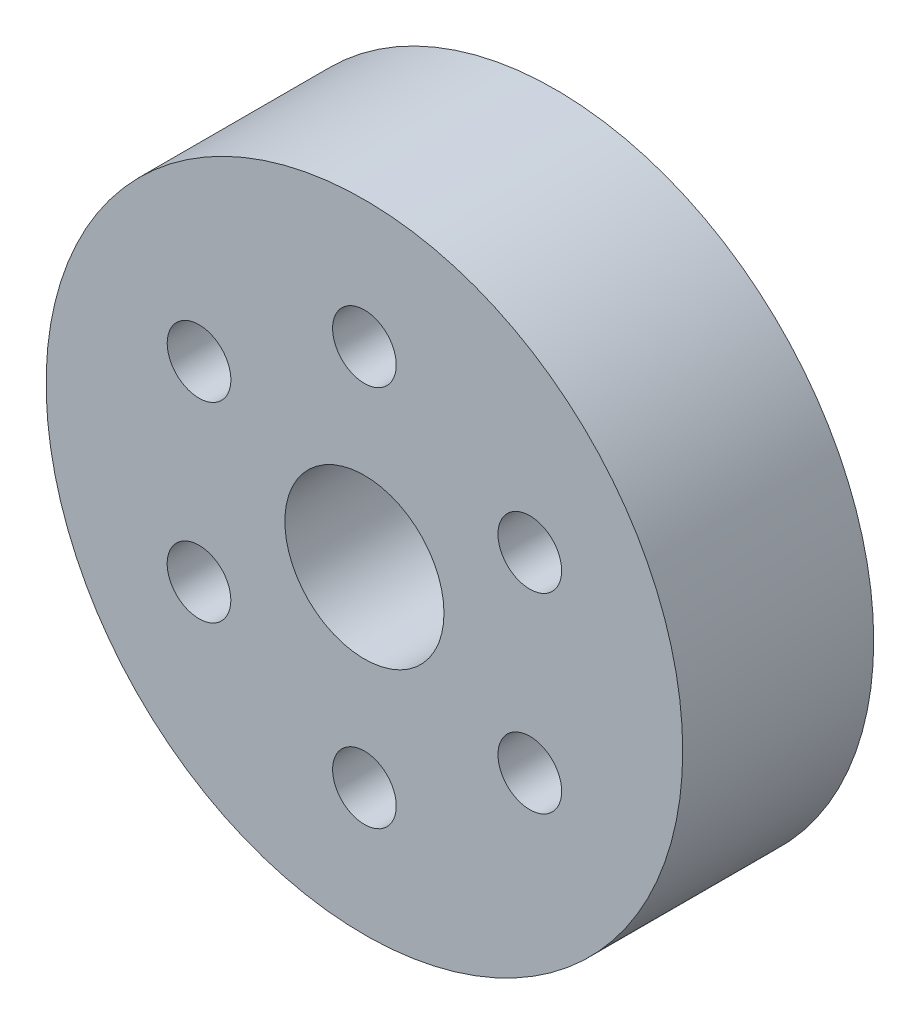
ISO-10303-21;
HEADER;
FILE_DESCRIPTION(('STEP AP214'),'2;1');
FILE_NAME('part.step','',(''),(''),'','','');
FILE_SCHEMA(('AUTOMOTIVE_DESIGN { 1 0 10303 214 1 1 1 1 }'));
ENDSEC;
DATA;
#1=APPLICATION_CONTEXT('core data for automotive mechanical design processes');
#2=APPLICATION_PROTOCOL_DEFINITION('international standard','automotive_design',2000,#1);
#3=PRODUCT_CONTEXT('',#1,'mechanical');
#4=PRODUCT('Part','Part','',(#3));
#5=PRODUCT_RELATED_PRODUCT_CATEGORY('part','',(#4));
#6=PRODUCT_DEFINITION_FORMATION('','',#4);
#7=PRODUCT_DEFINITION_CONTEXT('part definition',#1,'design');
#8=PRODUCT_DEFINITION('design','',#6,#7);
#9=PRODUCT_DEFINITION_SHAPE('','',#8);
#10=(LENGTH_UNIT() NAMED_UNIT(*) SI_UNIT(.MILLI.,.METRE.));
#11=(NAMED_UNIT(*) PLANE_ANGLE_UNIT() SI_UNIT($,.RADIAN.));
#12=(NAMED_UNIT(*) SI_UNIT($,.STERADIAN.) SOLID_ANGLE_UNIT());
#13=UNCERTAINTY_MEASURE_WITH_UNIT(LENGTH_MEASURE(1.E-05),#10,'distance_accuracy_value','');
#14=(GEOMETRIC_REPRESENTATION_CONTEXT(3) GLOBAL_UNCERTAINTY_ASSIGNED_CONTEXT((#13)) GLOBAL_UNIT_ASSIGNED_CONTEXT((#10,
#11,#12)) REPRESENTATION_CONTEXT('',''));
#15=CARTESIAN_POINT('',(0.,0.,0.));
#16=DIRECTION('',(0.,0.,1.));
#17=DIRECTION('',(1.,0.,0.));
#18=AXIS2_PLACEMENT_3D('',#15,#16,#17);
#19=CARTESIAN_POINT('',(0.,0.,15.));
#20=DIRECTION('',(0.,0.,1.));
#21=DIRECTION('',(1.,0.,0.));
#22=AXIS2_PLACEMENT_3D('',#19,#20,#21);
#23=PLANE('',#22);
#24=CARTESIAN_POINT('',(-25.980762113533,15.0000000000003,15.));
#25=DIRECTION('',(0.,0.,1.));
#26=DIRECTION('',(0.50000000000001,0.866025403784433,0.));
#27=AXIS2_PLACEMENT_3D('',#24,#25,#26);
#28=CIRCLE('',#27,5.);
#29=CARTESIAN_POINT('',(-23.4807621135329,19.3301270189225,15.));
#30=VERTEX_POINT('',#29);
#31=EDGE_CURVE('E84',#30,#30,#28,.T.);
#32=ORIENTED_EDGE('',*,*,#31,.F.);
#33=EDGE_LOOP('',(#32));
#34=FACE_BOUND('',#33,.T.);
#35=CARTESIAN_POINT('',(-25.9807621135333,-14.9999999999998,15.));
#36=DIRECTION('',(0.,0.,1.));
#37=DIRECTION('',(-0.499999999999992,0.866025403784443,0.));
#38=AXIS2_PLACEMENT_3D('',#35,#36,#37);
#39=CIRCLE('',#38,5.);
#40=CARTESIAN_POINT('',(-28.4807621135333,-10.6698729810775,15.));
#41=VERTEX_POINT('',#40);
#42=EDGE_CURVE('E92',#41,#41,#39,.T.);
#43=ORIENTED_EDGE('',*,*,#42,.F.);
#44=EDGE_LOOP('',(#43));
#45=FACE_BOUND('',#44,.T.);
#46=CARTESIAN_POINT('',(0.,-30.,15.));
#47=DIRECTION('',(0.,0.,1.));
#48=DIRECTION('',(-1.,0.,0.));
#49=AXIS2_PLACEMENT_3D('',#46,#47,#48);
#50=CIRCLE('',#49,5.);
#51=CARTESIAN_POINT('',(-5.,-30.,15.));
#52=VERTEX_POINT('',#51);
#53=EDGE_CURVE('E100',#52,#52,#50,.T.);
#54=ORIENTED_EDGE('',*,*,#53,.F.);
#55=EDGE_LOOP('',(#54));
#56=FACE_BOUND('',#55,.T.);
#57=CARTESIAN_POINT('',(25.9807621135331,-15.0000000000001,15.));
#58=DIRECTION('',(0.,0.,1.));
#59=DIRECTION('',(-0.500000000000004,-0.866025403784436,0.));
#60=AXIS2_PLACEMENT_3D('',#57,#58,#59);
#61=CIRCLE('',#60,5.);
#62=CARTESIAN_POINT('',(23.4807621135331,-19.3301270189223,15.));
#63=VERTEX_POINT('',#62);
#64=EDGE_CURVE('E108',#63,#63,#61,.T.);
#65=ORIENTED_EDGE('',*,*,#64,.F.);
#66=EDGE_LOOP('',(#65));
#67=FACE_BOUND('',#66,.T.);
#68=CARTESIAN_POINT('',(25.9807621135332,14.9999999999999,15.));
#69=DIRECTION('',(0.,0.,1.));
#70=DIRECTION('',(0.499999999999998,-0.86602540378444,0.));
#71=AXIS2_PLACEMENT_3D('',#68,#69,#70);
#72=CIRCLE('',#71,5.);
#73=CARTESIAN_POINT('',(28.4807621135332,10.6698729810777,15.));
#74=VERTEX_POINT('',#73);
#75=EDGE_CURVE('E76',#74,#74,#72,.T.);
#76=ORIENTED_EDGE('',*,*,#75,.F.);
#77=EDGE_LOOP('',(#76));
#78=FACE_BOUND('',#77,.T.);
#79=CARTESIAN_POINT('',(0.,30.,15.));
#80=DIRECTION('',(0.,0.,1.));
#81=DIRECTION('',(1.,0.,0.));
#82=AXIS2_PLACEMENT_3D('',#79,#80,#81);
#83=CIRCLE('',#82,5.);
#84=CARTESIAN_POINT('',(5.,30.,15.));
#85=VERTEX_POINT('',#84);
#86=EDGE_CURVE('E68',#85,#85,#83,.T.);
#87=ORIENTED_EDGE('',*,*,#86,.F.);
#88=EDGE_LOOP('',(#87));
#89=FACE_BOUND('',#88,.T.);
#90=CARTESIAN_POINT('',(0.,0.,15.));
#91=DIRECTION('',(0.,0.,1.));
#92=DIRECTION('',(1.,0.,0.));
#93=AXIS2_PLACEMENT_3D('',#90,#91,#92);
#94=CIRCLE('',#93,50.);
#95=CARTESIAN_POINT('',(50.,0.,15.));
#96=VERTEX_POINT('',#95);
#97=EDGE_CURVE('E10',#96,#96,#94,.T.);
#98=ORIENTED_EDGE('',*,*,#97,.T.);
#99=EDGE_LOOP('',(#98));
#100=FACE_BOUND('',#99,.T.);
#101=CARTESIAN_POINT('',(0.,0.,15.));
#102=DIRECTION('',(0.,0.,1.));
#103=DIRECTION('',(1.,0.,0.));
#104=AXIS2_PLACEMENT_3D('',#101,#102,#103);
#105=CIRCLE('',#104,12.5);
#106=CARTESIAN_POINT('',(12.5,0.,15.));
#107=VERTEX_POINT('',#106);
#108=EDGE_CURVE('E58',#107,#107,#105,.T.);
#109=ORIENTED_EDGE('',*,*,#108,.F.);
#110=EDGE_LOOP('',(#109));
#111=FACE_BOUND('',#110,.T.);
#112=ADVANCED_FACE('F45',(#34,#45,#56,#67,#78,#89,#100,#111),#23,.T.);
#113=CARTESIAN_POINT('',(0.,0.,-15.));
#114=DIRECTION('',(0.,0.,1.));
#115=DIRECTION('',(1.,0.,0.));
#116=AXIS2_PLACEMENT_3D('',#113,#114,#115);
#117=PLANE('',#116);
#118=CARTESIAN_POINT('',(-25.980762113533,15.0000000000003,-15.));
#119=DIRECTION('',(0.,0.,1.));
#120=DIRECTION('',(0.50000000000001,0.866025403784433,0.));
#121=AXIS2_PLACEMENT_3D('',#118,#119,#120);
#122=CIRCLE('',#121,5.);
#123=CARTESIAN_POINT('',(-23.4807621135329,19.3301270189225,-15.));
#124=VERTEX_POINT('',#123);
#125=EDGE_CURVE('E88',#124,#124,#122,.T.);
#126=ORIENTED_EDGE('',*,*,#125,.T.);
#127=EDGE_LOOP('',(#126));
#128=FACE_BOUND('',#127,.T.);
#129=CARTESIAN_POINT('',(-25.9807621135333,-14.9999999999998,-15.));
#130=DIRECTION('',(0.,0.,1.));
#131=DIRECTION('',(-0.499999999999992,0.866025403784443,0.));
#132=AXIS2_PLACEMENT_3D('',#129,#130,#131);
#133=CIRCLE('',#132,5.);
#134=CARTESIAN_POINT('',(-28.4807621135333,-10.6698729810775,-15.));
#135=VERTEX_POINT('',#134);
#136=EDGE_CURVE('E96',#135,#135,#133,.T.);
#137=ORIENTED_EDGE('',*,*,#136,.T.);
#138=EDGE_LOOP('',(#137));
#139=FACE_BOUND('',#138,.T.);
#140=CARTESIAN_POINT('',(0.,-30.,-15.));
#141=DIRECTION('',(0.,0.,1.));
#142=DIRECTION('',(-1.,0.,0.));
#143=AXIS2_PLACEMENT_3D('',#140,#141,#142);
#144=CIRCLE('',#143,5.);
#145=CARTESIAN_POINT('',(-5.,-30.,-15.));
#146=VERTEX_POINT('',#145);
#147=EDGE_CURVE('E104',#146,#146,#144,.T.);
#148=ORIENTED_EDGE('',*,*,#147,.T.);
#149=EDGE_LOOP('',(#148));
#150=FACE_BOUND('',#149,.T.);
#151=CARTESIAN_POINT('',(25.9807621135331,-15.0000000000001,-15.));
#152=DIRECTION('',(0.,0.,1.));
#153=DIRECTION('',(-0.500000000000004,-0.866025403784436,0.));
#154=AXIS2_PLACEMENT_3D('',#151,#152,#153);
#155=CIRCLE('',#154,5.);
#156=CARTESIAN_POINT('',(23.4807621135331,-19.3301270189223,-15.));
#157=VERTEX_POINT('',#156);
#158=EDGE_CURVE('E80',#157,#157,#155,.T.);
#159=ORIENTED_EDGE('',*,*,#158,.T.);
#160=EDGE_LOOP('',(#159));
#161=FACE_BOUND('',#160,.T.);
#162=CARTESIAN_POINT('',(25.9807621135332,14.9999999999999,-15.));
#163=DIRECTION('',(0.,0.,1.));
#164=DIRECTION('',(0.499999999999998,-0.86602540378444,0.));
#165=AXIS2_PLACEMENT_3D('',#162,#163,#164);
#166=CIRCLE('',#165,5.);
#167=CARTESIAN_POINT('',(28.4807621135332,10.6698729810777,-15.));
#168=VERTEX_POINT('',#167);
#169=EDGE_CURVE('E72',#168,#168,#166,.T.);
#170=ORIENTED_EDGE('',*,*,#169,.T.);
#171=EDGE_LOOP('',(#170));
#172=FACE_BOUND('',#171,.T.);
#173=CARTESIAN_POINT('',(0.,30.,-15.));
#174=DIRECTION('',(0.,0.,1.));
#175=DIRECTION('',(1.,0.,0.));
#176=AXIS2_PLACEMENT_3D('',#173,#174,#175);
#177=CIRCLE('',#176,5.);
#178=CARTESIAN_POINT('',(5.,30.,-15.));
#179=VERTEX_POINT('',#178);
#180=EDGE_CURVE('E64',#179,#179,#177,.T.);
#181=ORIENTED_EDGE('',*,*,#180,.T.);
#182=EDGE_LOOP('',(#181));
#183=FACE_BOUND('',#182,.T.);
#184=CARTESIAN_POINT('',(0.,0.,-15.));
#185=DIRECTION('',(0.,0.,1.));
#186=DIRECTION('',(1.,0.,0.));
#187=AXIS2_PLACEMENT_3D('',#184,#185,#186);
#188=CIRCLE('',#187,50.);
#189=CARTESIAN_POINT('',(50.,0.,-15.));
#190=VERTEX_POINT('',#189);
#191=EDGE_CURVE('E49',#190,#190,#188,.T.);
#192=ORIENTED_EDGE('',*,*,#191,.F.);
#193=EDGE_LOOP('',(#192));
#194=FACE_BOUND('',#193,.T.);
#195=CARTESIAN_POINT('',(0.,0.,-15.));
#196=DIRECTION('',(0.,0.,1.));
#197=DIRECTION('',(1.,0.,0.));
#198=AXIS2_PLACEMENT_3D('',#195,#196,#197);
#199=CIRCLE('',#198,12.5);
#200=CARTESIAN_POINT('',(12.5,0.,-15.));
#201=VERTEX_POINT('',#200);
#202=EDGE_CURVE('E60',#201,#201,#199,.T.);
#203=ORIENTED_EDGE('',*,*,#202,.T.);
#204=EDGE_LOOP('',(#203));
#205=FACE_BOUND('',#204,.T.);
#206=ADVANCED_FACE('F116',(#128,#139,#150,#161,#172,#183,#194,#205),#117,.F.);
#207=CARTESIAN_POINT('',(0.,0.,15.));
#208=DIRECTION('',(0.,0.,-1.));
#209=DIRECTION('',(-1.,0.,0.));
#210=AXIS2_PLACEMENT_3D('',#207,#208,#209);
#211=CYLINDRICAL_SURFACE('',#210,50.);
#212=ORIENTED_EDGE('',*,*,#97,.F.);
#213=EDGE_LOOP('',(#212));
#214=FACE_BOUND('',#213,.T.);
#215=ORIENTED_EDGE('',*,*,#191,.T.);
#216=EDGE_LOOP('',(#215));
#217=FACE_BOUND('',#216,.T.);
#218=ADVANCED_FACE('F47',(#214,#217),#211,.T.);
#219=CARTESIAN_POINT('',(0.,0.,15.));
#220=DIRECTION('',(0.,0.,-1.));
#221=DIRECTION('',(-1.,0.,0.));
#222=AXIS2_PLACEMENT_3D('',#219,#220,#221);
#223=CYLINDRICAL_SURFACE('',#222,12.5);
#224=ORIENTED_EDGE('',*,*,#108,.T.);
#225=EDGE_LOOP('',(#224));
#226=FACE_BOUND('',#225,.T.);
#227=ORIENTED_EDGE('',*,*,#202,.F.);
#228=EDGE_LOOP('',(#227));
#229=FACE_BOUND('',#228,.T.);
#230=ADVANCED_FACE('F137',(#226,#229),#223,.F.);
#231=CARTESIAN_POINT('',(0.,30.,-15.));
#232=DIRECTION('',(0.,0.,1.));
#233=DIRECTION('',(1.,0.,0.));
#234=AXIS2_PLACEMENT_3D('',#231,#232,#233);
#235=CYLINDRICAL_SURFACE('',#234,5.);
#236=ORIENTED_EDGE('',*,*,#180,.F.);
#237=EDGE_LOOP('',(#236));
#238=FACE_BOUND('',#237,.T.);
#239=ORIENTED_EDGE('',*,*,#86,.T.);
#240=EDGE_LOOP('',(#239));
#241=FACE_BOUND('',#240,.T.);
#242=ADVANCED_FACE('F140',(#238,#241),#235,.F.);
#243=CARTESIAN_POINT('',(25.9807621135332,14.9999999999999,-15.));
#244=DIRECTION('',(0.,0.,1.));
#245=DIRECTION('',(1.,0.,0.));
#246=AXIS2_PLACEMENT_3D('',#243,#244,#245);
#247=CYLINDRICAL_SURFACE('',#246,5.);
#248=ORIENTED_EDGE('',*,*,#169,.F.);
#249=EDGE_LOOP('',(#248));
#250=FACE_BOUND('',#249,.T.);
#251=ORIENTED_EDGE('',*,*,#75,.T.);
#252=EDGE_LOOP('',(#251));
#253=FACE_BOUND('',#252,.T.);
#254=ADVANCED_FACE('F123',(#250,#253),#247,.F.);
#255=CARTESIAN_POINT('',(25.9807621135331,-15.0000000000001,-15.));
#256=DIRECTION('',(0.,0.,1.));
#257=DIRECTION('',(1.,0.,0.));
#258=AXIS2_PLACEMENT_3D('',#255,#256,#257);
#259=CYLINDRICAL_SURFACE('',#258,5.);
#260=ORIENTED_EDGE('',*,*,#158,.F.);
#261=EDGE_LOOP('',(#260));
#262=FACE_BOUND('',#261,.T.);
#263=ORIENTED_EDGE('',*,*,#64,.T.);
#264=EDGE_LOOP('',(#263));
#265=FACE_BOUND('',#264,.T.);
#266=ADVANCED_FACE('F119',(#262,#265),#259,.F.);
#267=CARTESIAN_POINT('',(0.,-30.,-15.));
#268=DIRECTION('',(0.,0.,1.));
#269=DIRECTION('',(1.,0.,0.));
#270=AXIS2_PLACEMENT_3D('',#267,#268,#269);
#271=CYLINDRICAL_SURFACE('',#270,5.);
#272=ORIENTED_EDGE('',*,*,#147,.F.);
#273=EDGE_LOOP('',(#272));
#274=FACE_BOUND('',#273,.T.);
#275=ORIENTED_EDGE('',*,*,#53,.T.);
#276=EDGE_LOOP('',(#275));
#277=FACE_BOUND('',#276,.T.);
#278=ADVANCED_FACE('F122',(#274,#277),#271,.F.);
#279=CARTESIAN_POINT('',(-25.9807621135333,-14.9999999999998,-15.));
#280=DIRECTION('',(0.,0.,1.));
#281=DIRECTION('',(1.,0.,0.));
#282=AXIS2_PLACEMENT_3D('',#279,#280,#281);
#283=CYLINDRICAL_SURFACE('',#282,5.);
#284=ORIENTED_EDGE('',*,*,#136,.F.);
#285=EDGE_LOOP('',(#284));
#286=FACE_BOUND('',#285,.T.);
#287=ORIENTED_EDGE('',*,*,#42,.T.);
#288=EDGE_LOOP('',(#287));
#289=FACE_BOUND('',#288,.T.);
#290=ADVANCED_FACE('F161',(#286,#289),#283,.F.);
#291=CARTESIAN_POINT('',(-25.980762113533,15.0000000000003,-15.));
#292=DIRECTION('',(0.,0.,1.));
#293=DIRECTION('',(1.,0.,0.));
#294=AXIS2_PLACEMENT_3D('',#291,#292,#293);
#295=CYLINDRICAL_SURFACE('',#294,5.);
#296=ORIENTED_EDGE('',*,*,#125,.F.);
#297=EDGE_LOOP('',(#296));
#298=FACE_BOUND('',#297,.T.);
#299=ORIENTED_EDGE('',*,*,#31,.T.);
#300=EDGE_LOOP('',(#299));
#301=FACE_BOUND('',#300,.T.);
#302=ADVANCED_FACE('F158',(#298,#301),#295,.F.);
#303=CLOSED_SHELL('',(#112,#206,#218,#230,#242,#254,#266,#278,#290,#302));
#304=MANIFOLD_SOLID_BREP('B2',#303);
#305=ADVANCED_BREP_SHAPE_REPRESENTATION('',(#18,#304),#14);
#306=SHAPE_DEFINITION_REPRESENTATION(#9,#305);
ENDSEC;
END-ISO-10303-21;
